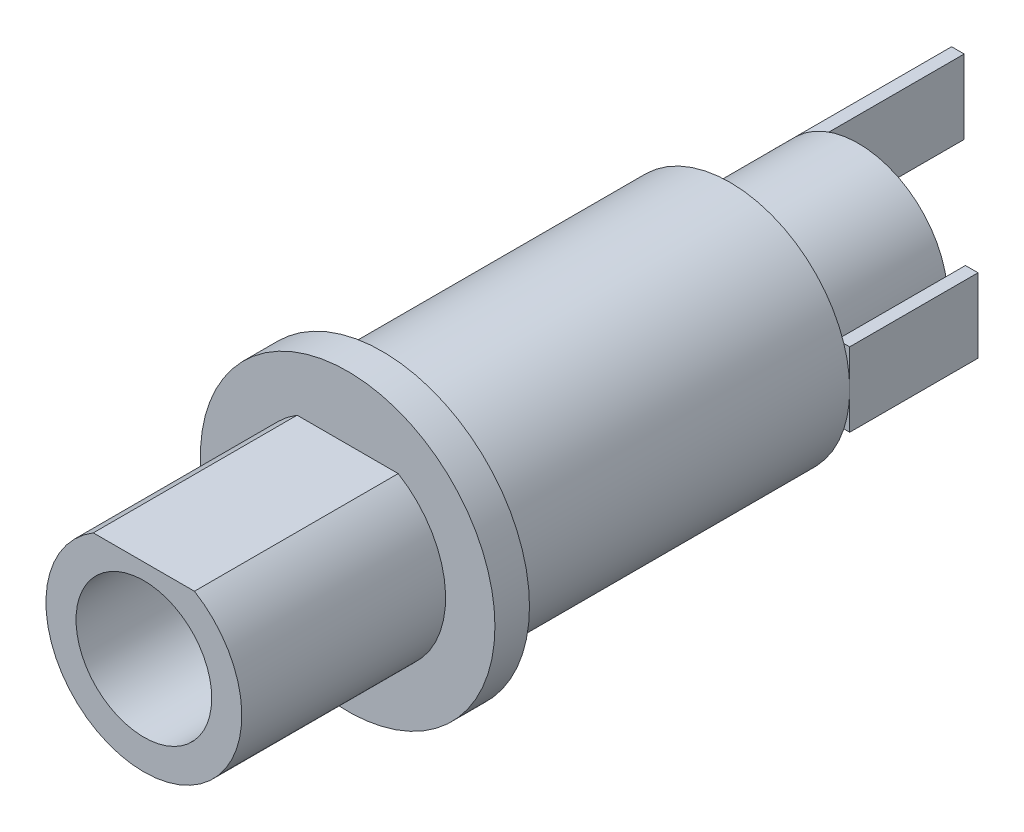
ISO-10303-21;
HEADER;
FILE_DESCRIPTION(('STEP AP214'),'2;1');
FILE_NAME('part.step','',(''),(''),'','','');
FILE_SCHEMA(('AUTOMOTIVE_DESIGN { 1 0 10303 214 1 1 1 1 }'));
ENDSEC;
DATA;
#1=APPLICATION_CONTEXT('core data for automotive mechanical design processes');
#2=APPLICATION_PROTOCOL_DEFINITION('international standard','automotive_design',2000,#1);
#3=PRODUCT_CONTEXT('',#1,'mechanical');
#4=PRODUCT('Part','Part','',(#3));
#5=PRODUCT_RELATED_PRODUCT_CATEGORY('part','',(#4));
#6=PRODUCT_DEFINITION_FORMATION('','',#4);
#7=PRODUCT_DEFINITION_CONTEXT('part definition',#1,'design');
#8=PRODUCT_DEFINITION('design','',#6,#7);
#9=PRODUCT_DEFINITION_SHAPE('','',#8);
#10=(LENGTH_UNIT() NAMED_UNIT(*) SI_UNIT(.MILLI.,.METRE.));
#11=(NAMED_UNIT(*) PLANE_ANGLE_UNIT() SI_UNIT($,.RADIAN.));
#12=(NAMED_UNIT(*) SI_UNIT($,.STERADIAN.) SOLID_ANGLE_UNIT());
#13=UNCERTAINTY_MEASURE_WITH_UNIT(LENGTH_MEASURE(1.E-05),#10,'distance_accuracy_value','');
#14=(GEOMETRIC_REPRESENTATION_CONTEXT(3) GLOBAL_UNCERTAINTY_ASSIGNED_CONTEXT((#13)) GLOBAL_UNIT_ASSIGNED_CONTEXT((#10,
#11,#12)) REPRESENTATION_CONTEXT('',''));
#15=CARTESIAN_POINT('',(0.,0.,0.));
#16=DIRECTION('',(0.,0.,1.));
#17=DIRECTION('',(1.,0.,0.));
#18=AXIS2_PLACEMENT_3D('',#15,#16,#17);
#19=CARTESIAN_POINT('',(0.,0.,-14.1));
#20=DIRECTION('',(0.,0.,-1.));
#21=DIRECTION('',(-1.,0.,0.));
#22=AXIS2_PLACEMENT_3D('',#19,#20,#21);
#23=PLANE('',#22);
#24=CARTESIAN_POINT('',(0.,0.,-14.1));
#25=DIRECTION('',(0.,0.,-1.));
#26=DIRECTION('',(-1.,0.,0.));
#27=AXIS2_PLACEMENT_3D('',#24,#25,#26);
#28=CIRCLE('',#27,3.62);
#29=CARTESIAN_POINT('',(-3.62,0.,-14.1));
#30=VERTEX_POINT('',#29);
#31=EDGE_CURVE('E194',#30,#30,#28,.T.);
#32=ORIENTED_EDGE('',*,*,#31,.F.);
#33=EDGE_LOOP('',(#32));
#34=FACE_BOUND('',#33,.T.);
#35=DIRECTION('',(0.,1.,0.));
#36=VECTOR('',#35,1.);
#37=CARTESIAN_POINT('',(4.34,1.5,-14.1));
#38=LINE('',#37,#36);
#39=CARTESIAN_POINT('',(4.34,-1.5,-14.1));
#40=VERTEX_POINT('',#39);
#41=CARTESIAN_POINT('',(4.34,1.5,-14.1));
#42=VERTEX_POINT('',#41);
#43=EDGE_CURVE('E172',#40,#42,#38,.T.);
#44=ORIENTED_EDGE('',*,*,#43,.F.);
#45=DIRECTION('',(1.,0.,0.));
#46=VECTOR('',#45,1.);
#47=CARTESIAN_POINT('',(0.,-1.5,-14.1));
#48=LINE('',#47,#46);
#49=CARTESIAN_POINT('',(4.61221205063254,-1.5,-14.1));
#50=VERTEX_POINT('',#49);
#51=EDGE_CURVE('E38',#40,#50,#48,.T.);
#52=ORIENTED_EDGE('',*,*,#51,.T.);
#53=CARTESIAN_POINT('',(0.,0.,-14.1));
#54=DIRECTION('',(0.,0.,-1.));
#55=DIRECTION('',(-1.,0.,0.));
#56=AXIS2_PLACEMENT_3D('',#53,#54,#55);
#57=CIRCLE('',#56,4.85);
#58=CARTESIAN_POINT('',(4.61221205063254,1.5,-14.1));
#59=VERTEX_POINT('',#58);
#60=EDGE_CURVE('E220',#50,#59,#57,.T.);
#61=ORIENTED_EDGE('',*,*,#60,.T.);
#62=DIRECTION('',(1.,0.,0.));
#63=VECTOR('',#62,1.);
#64=CARTESIAN_POINT('',(4.85,1.5,-14.1));
#65=LINE('',#64,#63);
#66=EDGE_CURVE('E161',#42,#59,#65,.T.);
#67=ORIENTED_EDGE('',*,*,#66,.F.);
#68=EDGE_LOOP('',(#44,#52,#61,#67));
#69=FACE_BOUND('',#68,.T.);
#70=ADVANCED_FACE('F34',(#34,#69),#23,.T.);
#71=CARTESIAN_POINT('',(0.,0.,9.66));
#72=DIRECTION('',(0.,0.,1.));
#73=DIRECTION('',(1.,0.,0.));
#74=AXIS2_PLACEMENT_3D('',#71,#72,#73);
#75=PLANE('',#74);
#76=CARTESIAN_POINT('',(0.,0.,9.66));
#77=DIRECTION('',(0.,0.,1.));
#78=DIRECTION('',(1.,0.,0.));
#79=AXIS2_PLACEMENT_3D('',#76,#77,#78);
#80=CIRCLE('',#79,2.75);
#81=CARTESIAN_POINT('',(2.75,0.,9.66));
#82=VERTEX_POINT('',#81);
#83=EDGE_CURVE('E211',#82,#82,#80,.T.);
#84=ORIENTED_EDGE('',*,*,#83,.F.);
#85=EDGE_LOOP('',(#84));
#86=FACE_BOUND('',#85,.T.);
#87=CARTESIAN_POINT('',(0.,0.,9.66));
#88=DIRECTION('',(0.,0.,1.));
#89=DIRECTION('',(1.,0.,0.));
#90=AXIS2_PLACEMENT_3D('',#87,#88,#89);
#91=CIRCLE('',#90,3.97);
#92=CARTESIAN_POINT('',(-2.04960971894651,3.4,9.66));
#93=VERTEX_POINT('',#92);
#94=CARTESIAN_POINT('',(2.04960971894651,3.4,9.66));
#95=VERTEX_POINT('',#94);
#96=EDGE_CURVE('E217',#93,#95,#91,.T.);
#97=ORIENTED_EDGE('',*,*,#96,.T.);
#98=DIRECTION('',(-1.,0.,0.));
#99=VECTOR('',#98,1.);
#100=CARTESIAN_POINT('',(5.971,3.4,9.66));
#101=LINE('',#100,#99);
#102=EDGE_CURVE('E204',#95,#93,#101,.T.);
#103=ORIENTED_EDGE('',*,*,#102,.T.);
#104=EDGE_LOOP('',(#97,#103));
#105=FACE_BOUND('',#104,.T.);
#106=ADVANCED_FACE('F261',(#86,#105),#75,.T.);
#107=CARTESIAN_POINT('',(0.,0.,9.66));
#108=DIRECTION('',(0.,0.,-1.));
#109=DIRECTION('',(-1.,0.,0.));
#110=AXIS2_PLACEMENT_3D('',#107,#108,#109);
#111=CYLINDRICAL_SURFACE('',#110,3.97);
#112=DIRECTION('',(0.,0.,-1.));
#113=VECTOR('',#112,1.);
#114=CARTESIAN_POINT('',(2.04960971894651,3.4,9.66));
#115=LINE('',#114,#113);
#116=CARTESIAN_POINT('',(2.04960971894651,3.4,1.4));
#117=VERTEX_POINT('',#116);
#118=EDGE_CURVE('E199',#117,#95,#115,.F.);
#119=ORIENTED_EDGE('',*,*,#118,.T.);
#120=ORIENTED_EDGE('',*,*,#96,.F.);
#121=DIRECTION('',(0.,0.,-1.));
#122=VECTOR('',#121,1.);
#123=CARTESIAN_POINT('',(-2.04960971894651,3.4,9.66));
#124=LINE('',#123,#122);
#125=CARTESIAN_POINT('',(-2.04960971894651,3.4,1.4));
#126=VERTEX_POINT('',#125);
#127=EDGE_CURVE('E192',#126,#93,#124,.F.);
#128=ORIENTED_EDGE('',*,*,#127,.F.);
#129=CARTESIAN_POINT('',(0.,0.,1.4));
#130=DIRECTION('',(0.,0.,1.));
#131=DIRECTION('',(1.,0.,0.));
#132=AXIS2_PLACEMENT_3D('',#129,#130,#131);
#133=CIRCLE('',#132,3.97);
#134=EDGE_CURVE('E216',#126,#117,#133,.T.);
#135=ORIENTED_EDGE('',*,*,#134,.T.);
#136=EDGE_LOOP('',(#119,#120,#128,#135));
#137=FACE_BOUND('',#136,.T.);
#138=ADVANCED_FACE('F267',(#137),#111,.T.);
#139=CARTESIAN_POINT('',(0.,0.,1.4));
#140=DIRECTION('',(0.,0.,-1.));
#141=DIRECTION('',(-1.,0.,0.));
#142=AXIS2_PLACEMENT_3D('',#139,#140,#141);
#143=CYLINDRICAL_SURFACE('',#142,5.97);
#144=CARTESIAN_POINT('',(0.,0.,1.4));
#145=DIRECTION('',(0.,0.,1.));
#146=DIRECTION('',(1.,0.,0.));
#147=AXIS2_PLACEMENT_3D('',#144,#145,#146);
#148=CIRCLE('',#147,5.97);
#149=CARTESIAN_POINT('',(5.97,0.,1.4));
#150=VERTEX_POINT('',#149);
#151=EDGE_CURVE('E230',#150,#150,#148,.T.);
#152=ORIENTED_EDGE('',*,*,#151,.F.);
#153=EDGE_LOOP('',(#152));
#154=FACE_BOUND('',#153,.T.);
#155=CARTESIAN_POINT('',(0.,0.,0.));
#156=DIRECTION('',(0.,0.,1.));
#157=DIRECTION('',(1.,0.,0.));
#158=AXIS2_PLACEMENT_3D('',#155,#156,#157);
#159=CIRCLE('',#158,5.97);
#160=CARTESIAN_POINT('',(5.97,0.,0.));
#161=VERTEX_POINT('',#160);
#162=EDGE_CURVE('E225',#161,#161,#159,.T.);
#163=ORIENTED_EDGE('',*,*,#162,.T.);
#164=EDGE_LOOP('',(#163));
#165=FACE_BOUND('',#164,.T.);
#166=ADVANCED_FACE('F36',(#154,#165),#143,.T.);
#167=CARTESIAN_POINT('',(0.,0.,1.4));
#168=DIRECTION('',(0.,0.,1.));
#169=DIRECTION('',(1.,0.,0.));
#170=AXIS2_PLACEMENT_3D('',#167,#168,#169);
#171=PLANE('',#170);
#172=ORIENTED_EDGE('',*,*,#134,.F.);
#173=DIRECTION('',(-1.,0.,0.));
#174=VECTOR('',#173,1.);
#175=CARTESIAN_POINT('',(5.971,3.4,1.4));
#176=LINE('',#175,#174);
#177=EDGE_CURVE('E202',#117,#126,#176,.T.);
#178=ORIENTED_EDGE('',*,*,#177,.F.);
#179=EDGE_LOOP('',(#172,#178));
#180=FACE_BOUND('',#179,.T.);
#181=ORIENTED_EDGE('',*,*,#151,.T.);
#182=EDGE_LOOP('',(#181));
#183=FACE_BOUND('',#182,.T.);
#184=ADVANCED_FACE('F244',(#180,#183),#171,.T.);
#185=CARTESIAN_POINT('',(0.,0.,0.));
#186=DIRECTION('',(0.,0.,1.));
#187=DIRECTION('',(1.,0.,0.));
#188=AXIS2_PLACEMENT_3D('',#185,#186,#187);
#189=PLANE('',#188);
#190=CARTESIAN_POINT('',(0.,0.,0.));
#191=DIRECTION('',(0.,0.,-1.));
#192=DIRECTION('',(-1.,0.,0.));
#193=AXIS2_PLACEMENT_3D('',#190,#191,#192);
#194=CIRCLE('',#193,4.85);
#195=CARTESIAN_POINT('',(-4.85,0.,0.));
#196=VERTEX_POINT('',#195);
#197=EDGE_CURVE('E227',#196,#196,#194,.T.);
#198=ORIENTED_EDGE('',*,*,#197,.F.);
#199=EDGE_LOOP('',(#198));
#200=FACE_BOUND('',#199,.T.);
#201=ORIENTED_EDGE('',*,*,#162,.F.);
#202=EDGE_LOOP('',(#201));
#203=FACE_BOUND('',#202,.T.);
#204=ADVANCED_FACE('F258',(#200,#203),#189,.F.);
#205=CARTESIAN_POINT('',(0.,0.,-14.1));
#206=DIRECTION('',(0.,0.,1.));
#207=DIRECTION('',(1.,0.,0.));
#208=AXIS2_PLACEMENT_3D('',#205,#206,#207);
#209=CYLINDRICAL_SURFACE('',#208,4.85);
#210=CARTESIAN_POINT('',(4.85,0.,-14.1));
#211=VERTEX_POINT('',#210);
#212=EDGE_CURVE('E223',#59,#211,#57,.T.);
#213=ORIENTED_EDGE('',*,*,#212,.F.);
#214=ORIENTED_EDGE('',*,*,#60,.F.);
#215=EDGE_CURVE('E226',#211,#50,#57,.T.);
#216=ORIENTED_EDGE('',*,*,#215,.F.);
#217=EDGE_LOOP('',(#213,#214,#216));
#218=FACE_BOUND('',#217,.T.);
#219=ORIENTED_EDGE('',*,*,#197,.T.);
#220=EDGE_LOOP('',(#219));
#221=FACE_BOUND('',#220,.T.);
#222=ADVANCED_FACE('F252',(#218,#221),#209,.T.);
#223=CARTESIAN_POINT('',(0.,0.,9.66));
#224=DIRECTION('',(0.,0.,-1.));
#225=DIRECTION('',(-1.,0.,0.));
#226=AXIS2_PLACEMENT_3D('',#223,#224,#225);
#227=CYLINDRICAL_SURFACE('',#226,2.75);
#228=ORIENTED_EDGE('',*,*,#83,.T.);
#229=EDGE_LOOP('',(#228));
#230=FACE_BOUND('',#229,.T.);
#231=CARTESIAN_POINT('',(0.,0.,1.4));
#232=DIRECTION('',(0.,0.,1.));
#233=DIRECTION('',(1.,0.,0.));
#234=AXIS2_PLACEMENT_3D('',#231,#232,#233);
#235=CIRCLE('',#234,2.75);
#236=CARTESIAN_POINT('',(2.75,0.,1.4));
#237=VERTEX_POINT('',#236);
#238=EDGE_CURVE('E197',#237,#237,#235,.F.);
#239=ORIENTED_EDGE('',*,*,#238,.T.);
#240=EDGE_LOOP('',(#239));
#241=FACE_BOUND('',#240,.T.);
#242=ADVANCED_FACE('F237',(#230,#241),#227,.F.);
#243=CARTESIAN_POINT('',(0.,0.,1.4));
#244=DIRECTION('',(0.,0.,1.));
#245=DIRECTION('',(1.,0.,0.));
#246=AXIS2_PLACEMENT_3D('',#243,#244,#245);
#247=CIRCLE('',#246,1.);
#248=CARTESIAN_POINT('',(1.,0.,1.4));
#249=VERTEX_POINT('',#248);
#250=EDGE_CURVE('E207',#249,#249,#247,.T.);
#251=ORIENTED_EDGE('',*,*,#250,.F.);
#252=EDGE_LOOP('',(#251));
#253=FACE_BOUND('',#252,.T.);
#254=ORIENTED_EDGE('',*,*,#238,.F.);
#255=EDGE_LOOP('',(#254));
#256=FACE_BOUND('',#255,.T.);
#257=ADVANCED_FACE('F239',(#253,#256),#171,.T.);
#258=CARTESIAN_POINT('',(0.,0.,6.4));
#259=DIRECTION('',(0.,0.,-1.));
#260=DIRECTION('',(-1.,0.,0.));
#261=AXIS2_PLACEMENT_3D('',#258,#259,#260);
#262=CYLINDRICAL_SURFACE('',#261,1.);
#263=CARTESIAN_POINT('',(0.,0.,6.4));
#264=DIRECTION('',(0.,0.,1.));
#265=DIRECTION('',(1.,0.,0.));
#266=AXIS2_PLACEMENT_3D('',#263,#264,#265);
#267=CIRCLE('',#266,1.);
#268=CARTESIAN_POINT('',(1.,0.,6.4));
#269=VERTEX_POINT('',#268);
#270=EDGE_CURVE('E208',#269,#269,#267,.T.);
#271=ORIENTED_EDGE('',*,*,#270,.F.);
#272=EDGE_LOOP('',(#271));
#273=FACE_BOUND('',#272,.T.);
#274=ORIENTED_EDGE('',*,*,#250,.T.);
#275=EDGE_LOOP('',(#274));
#276=FACE_BOUND('',#275,.T.);
#277=ADVANCED_FACE('F241',(#273,#276),#262,.T.);
#278=CARTESIAN_POINT('',(0.,0.,6.4));
#279=DIRECTION('',(0.,0.,1.));
#280=DIRECTION('',(1.,0.,0.));
#281=AXIS2_PLACEMENT_3D('',#278,#279,#280);
#282=PLANE('',#281);
#283=ORIENTED_EDGE('',*,*,#270,.T.);
#284=EDGE_LOOP('',(#283));
#285=FACE_BOUND('',#284,.T.);
#286=ADVANCED_FACE('F249',(#285),#282,.T.);
#287=CARTESIAN_POINT('',(5.971,3.4,1.4));
#288=DIRECTION('',(0.,1.,0.));
#289=DIRECTION('',(0.,0.,1.));
#290=AXIS2_PLACEMENT_3D('',#287,#288,#289);
#291=PLANE('',#290);
#292=ORIENTED_EDGE('',*,*,#177,.T.);
#293=ORIENTED_EDGE('',*,*,#127,.T.);
#294=ORIENTED_EDGE('',*,*,#102,.F.);
#295=ORIENTED_EDGE('',*,*,#118,.F.);
#296=EDGE_LOOP('',(#292,#293,#294,#295));
#297=FACE_BOUND('',#296,.T.);
#298=ADVANCED_FACE('F303',(#297),#291,.T.);
#299=CARTESIAN_POINT('',(0.,0.,-19.3));
#300=DIRECTION('',(0.,0.,1.));
#301=DIRECTION('',(1.,0.,0.));
#302=AXIS2_PLACEMENT_3D('',#299,#300,#301);
#303=CYLINDRICAL_SURFACE('',#302,3.62);
#304=CARTESIAN_POINT('',(0.,0.,-19.3));
#305=DIRECTION('',(0.,0.,-1.));
#306=DIRECTION('',(-1.,0.,0.));
#307=AXIS2_PLACEMENT_3D('',#304,#305,#306);
#308=CIRCLE('',#307,3.62);
#309=CARTESIAN_POINT('',(-3.62,0.,-19.3));
#310=VERTEX_POINT('',#309);
#311=CARTESIAN_POINT('',(-3.29460164511584,1.5,-19.3));
#312=VERTEX_POINT('',#311);
#313=EDGE_CURVE('E189',#310,#312,#308,.T.);
#314=ORIENTED_EDGE('',*,*,#313,.F.);
#315=CARTESIAN_POINT('',(-3.29460164511584,-1.5,-19.3));
#316=VERTEX_POINT('',#315);
#317=EDGE_CURVE('E188',#316,#310,#308,.T.);
#318=ORIENTED_EDGE('',*,*,#317,.F.);
#319=EDGE_CURVE('E193',#312,#316,#308,.T.);
#320=ORIENTED_EDGE('',*,*,#319,.F.);
#321=EDGE_LOOP('',(#314,#318,#320));
#322=FACE_BOUND('',#321,.T.);
#323=ORIENTED_EDGE('',*,*,#31,.T.);
#324=EDGE_LOOP('',(#323));
#325=FACE_BOUND('',#324,.T.);
#326=ADVANCED_FACE('F305',(#322,#325),#303,.T.);
#327=CARTESIAN_POINT('',(0.,0.,-19.3));
#328=DIRECTION('',(0.,0.,-1.));
#329=DIRECTION('',(-1.,0.,0.));
#330=AXIS2_PLACEMENT_3D('',#327,#328,#329);
#331=PLANE('',#330);
#332=DIRECTION('',(1.,0.,0.));
#333=VECTOR('',#332,1.);
#334=CARTESIAN_POINT('',(-3.11,1.5,-19.3));
#335=LINE('',#334,#333);
#336=CARTESIAN_POINT('',(-3.11,1.5,-19.3));
#337=VERTEX_POINT('',#336);
#338=EDGE_CURVE('E11',#312,#337,#335,.T.);
#339=ORIENTED_EDGE('',*,*,#338,.F.);
#340=ORIENTED_EDGE('',*,*,#319,.T.);
#341=DIRECTION('',(-1.,0.,0.));
#342=VECTOR('',#341,1.);
#343=CARTESIAN_POINT('',(-3.11,-1.5,-19.3));
#344=LINE('',#343,#342);
#345=CARTESIAN_POINT('',(-3.11,-1.5,-19.3));
#346=VERTEX_POINT('',#345);
#347=EDGE_CURVE('E55',#346,#316,#344,.T.);
#348=ORIENTED_EDGE('',*,*,#347,.F.);
#349=DIRECTION('',(0.,-1.,0.));
#350=VECTOR('',#349,1.);
#351=CARTESIAN_POINT('',(-3.11,1.5,-19.3));
#352=LINE('',#351,#350);
#353=EDGE_CURVE('E51',#337,#346,#352,.T.);
#354=ORIENTED_EDGE('',*,*,#353,.F.);
#355=EDGE_LOOP('',(#339,#340,#348,#354));
#356=FACE_BOUND('',#355,.T.);
#357=ADVANCED_FACE('F311',(#356),#331,.T.);
#358=CARTESIAN_POINT('',(0.,0.,-14.1));
#359=DIRECTION('',(0.,0.,-1.));
#360=DIRECTION('',(-1.,0.,0.));
#361=AXIS2_PLACEMENT_3D('',#358,#359,#360);
#362=PLANE('',#361);
#363=CARTESIAN_POINT('',(4.85,1.5,-14.1));
#364=VERTEX_POINT('',#363);
#365=EDGE_CURVE('E175',#59,#364,#65,.T.);
#366=ORIENTED_EDGE('',*,*,#365,.F.);
#367=ORIENTED_EDGE('',*,*,#212,.T.);
#368=DIRECTION('',(0.,-1.,0.));
#369=VECTOR('',#368,1.);
#370=CARTESIAN_POINT('',(4.85,1.5,-14.1));
#371=LINE('',#370,#369);
#372=EDGE_CURVE('E151',#364,#211,#371,.T.);
#373=ORIENTED_EDGE('',*,*,#372,.F.);
#374=EDGE_LOOP('',(#366,#367,#373));
#375=FACE_BOUND('',#374,.T.);
#376=ADVANCED_FACE('F319',(#375),#362,.F.);
#377=CARTESIAN_POINT('',(4.85,1.5,-19.3));
#378=DIRECTION('',(-1.,0.,0.));
#379=DIRECTION('',(0.,0.,1.));
#380=AXIS2_PLACEMENT_3D('',#377,#378,#379);
#381=PLANE('',#380);
#382=ORIENTED_EDGE('',*,*,#372,.T.);
#383=CARTESIAN_POINT('',(4.85,-1.5,-14.1));
#384=VERTEX_POINT('',#383);
#385=EDGE_CURVE('E149',#211,#384,#371,.T.);
#386=ORIENTED_EDGE('',*,*,#385,.T.);
#387=DIRECTION('',(0.,0.,1.));
#388=VECTOR('',#387,1.);
#389=CARTESIAN_POINT('',(4.85,-1.5,-19.3));
#390=LINE('',#389,#388);
#391=CARTESIAN_POINT('',(4.85,-1.5,-19.3));
#392=VERTEX_POINT('',#391);
#393=EDGE_CURVE('E185',#392,#384,#390,.T.);
#394=ORIENTED_EDGE('',*,*,#393,.F.);
#395=DIRECTION('',(0.,-1.,0.));
#396=VECTOR('',#395,1.);
#397=CARTESIAN_POINT('',(4.85,1.5,-19.3));
#398=LINE('',#397,#396);
#399=CARTESIAN_POINT('',(4.85,1.5,-19.3));
#400=VERTEX_POINT('',#399);
#401=EDGE_CURVE('E157',#400,#392,#398,.T.);
#402=ORIENTED_EDGE('',*,*,#401,.F.);
#403=DIRECTION('',(0.,0.,1.));
#404=VECTOR('',#403,1.);
#405=CARTESIAN_POINT('',(4.85,1.5,-19.3));
#406=LINE('',#405,#404);
#407=EDGE_CURVE('E166',#400,#364,#406,.T.);
#408=ORIENTED_EDGE('',*,*,#407,.T.);
#409=EDGE_LOOP('',(#382,#386,#394,#402,#408));
#410=FACE_BOUND('',#409,.T.);
#411=ADVANCED_FACE('F320',(#410),#381,.F.);
#412=CARTESIAN_POINT('',(4.85,-1.5,-19.3));
#413=DIRECTION('',(0.,1.,0.));
#414=DIRECTION('',(0.,0.,1.));
#415=AXIS2_PLACEMENT_3D('',#412,#413,#414);
#416=PLANE('',#415);
#417=DIRECTION('',(-1.,0.,0.));
#418=VECTOR('',#417,1.);
#419=CARTESIAN_POINT('',(4.85,-1.5,-14.1));
#420=LINE('',#419,#418);
#421=EDGE_CURVE('E169',#384,#50,#420,.T.);
#422=ORIENTED_EDGE('',*,*,#421,.T.);
#423=ORIENTED_EDGE('',*,*,#51,.F.);
#424=DIRECTION('',(0.,0.,1.));
#425=VECTOR('',#424,1.);
#426=CARTESIAN_POINT('',(4.34,-1.5,-19.3));
#427=LINE('',#426,#425);
#428=CARTESIAN_POINT('',(4.34,-1.5,-19.3));
#429=VERTEX_POINT('',#428);
#430=EDGE_CURVE('E182',#429,#40,#427,.T.);
#431=ORIENTED_EDGE('',*,*,#430,.F.);
#432=DIRECTION('',(-1.,0.,0.));
#433=VECTOR('',#432,1.);
#434=CARTESIAN_POINT('',(4.85,-1.5,-19.3));
#435=LINE('',#434,#433);
#436=EDGE_CURVE('E160',#392,#429,#435,.T.);
#437=ORIENTED_EDGE('',*,*,#436,.F.);
#438=ORIENTED_EDGE('',*,*,#393,.T.);
#439=EDGE_LOOP('',(#422,#423,#431,#437,#438));
#440=FACE_BOUND('',#439,.T.);
#441=ADVANCED_FACE('F323',(#440),#416,.F.);
#442=CARTESIAN_POINT('',(4.34,1.5,-19.3));
#443=DIRECTION('',(1.,0.,0.));
#444=DIRECTION('',(0.,0.,-1.));
#445=AXIS2_PLACEMENT_3D('',#442,#443,#444);
#446=PLANE('',#445);
#447=ORIENTED_EDGE('',*,*,#43,.T.);
#448=DIRECTION('',(0.,0.,1.));
#449=VECTOR('',#448,1.);
#450=CARTESIAN_POINT('',(4.34,1.5,-19.3));
#451=LINE('',#450,#449);
#452=CARTESIAN_POINT('',(4.34,1.5,-19.3));
#453=VERTEX_POINT('',#452);
#454=EDGE_CURVE('E180',#453,#42,#451,.T.);
#455=ORIENTED_EDGE('',*,*,#454,.F.);
#456=DIRECTION('',(0.,1.,0.));
#457=VECTOR('',#456,1.);
#458=CARTESIAN_POINT('',(4.34,1.5,-19.3));
#459=LINE('',#458,#457);
#460=EDGE_CURVE('E163',#429,#453,#459,.T.);
#461=ORIENTED_EDGE('',*,*,#460,.F.);
#462=ORIENTED_EDGE('',*,*,#430,.T.);
#463=EDGE_LOOP('',(#447,#455,#461,#462));
#464=FACE_BOUND('',#463,.T.);
#465=ADVANCED_FACE('F327',(#464),#446,.F.);
#466=CARTESIAN_POINT('',(4.85,1.5,-19.3));
#467=DIRECTION('',(0.,-1.,0.));
#468=DIRECTION('',(0.,0.,-1.));
#469=AXIS2_PLACEMENT_3D('',#466,#467,#468);
#470=PLANE('',#469);
#471=ORIENTED_EDGE('',*,*,#66,.T.);
#472=ORIENTED_EDGE('',*,*,#365,.T.);
#473=ORIENTED_EDGE('',*,*,#407,.F.);
#474=DIRECTION('',(1.,0.,0.));
#475=VECTOR('',#474,1.);
#476=CARTESIAN_POINT('',(4.85,1.5,-19.3));
#477=LINE('',#476,#475);
#478=EDGE_CURVE('E165',#453,#400,#477,.T.);
#479=ORIENTED_EDGE('',*,*,#478,.F.);
#480=ORIENTED_EDGE('',*,*,#454,.T.);
#481=EDGE_LOOP('',(#471,#472,#473,#479,#480));
#482=FACE_BOUND('',#481,.T.);
#483=ADVANCED_FACE('F331',(#482),#470,.F.);
#484=CARTESIAN_POINT('',(0.,0.,-19.3));
#485=DIRECTION('',(0.,0.,-1.));
#486=DIRECTION('',(-1.,0.,0.));
#487=AXIS2_PLACEMENT_3D('',#484,#485,#486);
#488=PLANE('',#487);
#489=ORIENTED_EDGE('',*,*,#401,.T.);
#490=ORIENTED_EDGE('',*,*,#436,.T.);
#491=ORIENTED_EDGE('',*,*,#460,.T.);
#492=ORIENTED_EDGE('',*,*,#478,.T.);
#493=EDGE_LOOP('',(#489,#490,#491,#492));
#494=FACE_BOUND('',#493,.T.);
#495=ADVANCED_FACE('F335',(#494),#488,.T.);
#496=ORIENTED_EDGE('',*,*,#385,.F.);
#497=ORIENTED_EDGE('',*,*,#215,.T.);
#498=ORIENTED_EDGE('',*,*,#421,.F.);
#499=EDGE_LOOP('',(#496,#497,#498));
#500=FACE_BOUND('',#499,.T.);
#501=ADVANCED_FACE('F337',(#500),#362,.F.);
#502=CARTESIAN_POINT('',(0.,0.,-19.3));
#503=DIRECTION('',(0.,0.,-1.));
#504=DIRECTION('',(-1.,0.,0.));
#505=AXIS2_PLACEMENT_3D('',#502,#503,#504);
#506=PLANE('',#505);
#507=DIRECTION('',(0.,1.,0.));
#508=VECTOR('',#507,1.);
#509=CARTESIAN_POINT('',(-3.62,1.5,-19.3));
#510=LINE('',#509,#508);
#511=CARTESIAN_POINT('',(-3.62,1.5,-19.3));
#512=VERTEX_POINT('',#511);
#513=EDGE_CURVE('E548',#310,#512,#510,.T.);
#514=ORIENTED_EDGE('',*,*,#513,.F.);
#515=ORIENTED_EDGE('',*,*,#313,.T.);
#516=EDGE_CURVE('E44',#512,#312,#335,.T.);
#517=ORIENTED_EDGE('',*,*,#516,.F.);
#518=EDGE_LOOP('',(#514,#515,#517));
#519=FACE_BOUND('',#518,.T.);
#520=ADVANCED_FACE('F340',(#519),#506,.F.);
#521=CARTESIAN_POINT('',(-3.62,-1.5,-19.3));
#522=VERTEX_POINT('',#521);
#523=EDGE_CURVE('E542',#316,#522,#344,.T.);
#524=ORIENTED_EDGE('',*,*,#523,.F.);
#525=ORIENTED_EDGE('',*,*,#317,.T.);
#526=EDGE_CURVE('E546',#522,#310,#510,.T.);
#527=ORIENTED_EDGE('',*,*,#526,.F.);
#528=EDGE_LOOP('',(#524,#525,#527));
#529=FACE_BOUND('',#528,.T.);
#530=ADVANCED_FACE('F347',(#529),#506,.F.);
#531=CARTESIAN_POINT('',(-3.11,1.5,-26.7));
#532=DIRECTION('',(-1.,0.,0.));
#533=DIRECTION('',(0.,0.,1.));
#534=AXIS2_PLACEMENT_3D('',#531,#532,#533);
#535=PLANE('',#534);
#536=ORIENTED_EDGE('',*,*,#353,.T.);
#537=DIRECTION('',(0.,0.,1.));
#538=VECTOR('',#537,1.);
#539=CARTESIAN_POINT('',(-3.11,-1.5,-26.7));
#540=LINE('',#539,#538);
#541=CARTESIAN_POINT('',(-3.11,-1.5,-26.7));
#542=VERTEX_POINT('',#541);
#543=EDGE_CURVE('E132',#542,#346,#540,.T.);
#544=ORIENTED_EDGE('',*,*,#543,.F.);
#545=DIRECTION('',(0.,-1.,0.));
#546=VECTOR('',#545,1.);
#547=CARTESIAN_POINT('',(-3.11,1.5,-26.7));
#548=LINE('',#547,#546);
#549=CARTESIAN_POINT('',(-3.11,1.5,-26.7));
#550=VERTEX_POINT('',#549);
#551=EDGE_CURVE('E138',#550,#542,#548,.T.);
#552=ORIENTED_EDGE('',*,*,#551,.F.);
#553=DIRECTION('',(0.,0.,1.));
#554=VECTOR('',#553,1.);
#555=CARTESIAN_POINT('',(-3.11,1.5,-26.7));
#556=LINE('',#555,#554);
#557=EDGE_CURVE('E554',#550,#337,#556,.T.);
#558=ORIENTED_EDGE('',*,*,#557,.T.);
#559=EDGE_LOOP('',(#536,#544,#552,#558));
#560=FACE_BOUND('',#559,.T.);
#561=ADVANCED_FACE('F148',(#560),#535,.F.);
#562=CARTESIAN_POINT('',(-3.11,-1.5,-26.7));
#563=DIRECTION('',(0.,1.,0.));
#564=DIRECTION('',(0.,0.,1.));
#565=AXIS2_PLACEMENT_3D('',#562,#563,#564);
#566=PLANE('',#565);
#567=ORIENTED_EDGE('',*,*,#347,.T.);
#568=ORIENTED_EDGE('',*,*,#523,.T.);
#569=DIRECTION('',(0.,0.,1.));
#570=VECTOR('',#569,1.);
#571=CARTESIAN_POINT('',(-3.62,-1.5,-26.7));
#572=LINE('',#571,#570);
#573=CARTESIAN_POINT('',(-3.62,-1.5,-26.7));
#574=VERTEX_POINT('',#573);
#575=EDGE_CURVE('E134',#574,#522,#572,.T.);
#576=ORIENTED_EDGE('',*,*,#575,.F.);
#577=DIRECTION('',(-1.,0.,0.));
#578=VECTOR('',#577,1.);
#579=CARTESIAN_POINT('',(-3.11,-1.5,-26.7));
#580=LINE('',#579,#578);
#581=EDGE_CURVE('E128',#542,#574,#580,.T.);
#582=ORIENTED_EDGE('',*,*,#581,.F.);
#583=ORIENTED_EDGE('',*,*,#543,.T.);
#584=EDGE_LOOP('',(#567,#568,#576,#582,#583));
#585=FACE_BOUND('',#584,.T.);
#586=ADVANCED_FACE('F130',(#585),#566,.F.);
#587=CARTESIAN_POINT('',(-3.62,1.5,-26.7));
#588=DIRECTION('',(1.,0.,0.));
#589=DIRECTION('',(0.,0.,-1.));
#590=AXIS2_PLACEMENT_3D('',#587,#588,#589);
#591=PLANE('',#590);
#592=ORIENTED_EDGE('',*,*,#526,.T.);
#593=ORIENTED_EDGE('',*,*,#513,.T.);
#594=DIRECTION('',(0.,0.,1.));
#595=VECTOR('',#594,1.);
#596=CARTESIAN_POINT('',(-3.62,1.5,-26.7));
#597=LINE('',#596,#595);
#598=CARTESIAN_POINT('',(-3.62,1.5,-26.7));
#599=VERTEX_POINT('',#598);
#600=EDGE_CURVE('E153',#599,#512,#597,.T.);
#601=ORIENTED_EDGE('',*,*,#600,.F.);
#602=DIRECTION('',(0.,1.,0.));
#603=VECTOR('',#602,1.);
#604=CARTESIAN_POINT('',(-3.62,1.5,-26.7));
#605=LINE('',#604,#603);
#606=EDGE_CURVE('E137',#574,#599,#605,.T.);
#607=ORIENTED_EDGE('',*,*,#606,.F.);
#608=ORIENTED_EDGE('',*,*,#575,.T.);
#609=EDGE_LOOP('',(#592,#593,#601,#607,#608));
#610=FACE_BOUND('',#609,.T.);
#611=ADVANCED_FACE('F350',(#610),#591,.F.);
#612=CARTESIAN_POINT('',(-3.11,1.5,-26.7));
#613=DIRECTION('',(0.,-1.,0.));
#614=DIRECTION('',(0.,0.,-1.));
#615=AXIS2_PLACEMENT_3D('',#612,#613,#614);
#616=PLANE('',#615);
#617=ORIENTED_EDGE('',*,*,#516,.T.);
#618=ORIENTED_EDGE('',*,*,#338,.T.);
#619=ORIENTED_EDGE('',*,*,#557,.F.);
#620=DIRECTION('',(1.,0.,0.));
#621=VECTOR('',#620,1.);
#622=CARTESIAN_POINT('',(-3.11,1.5,-26.7));
#623=LINE('',#622,#621);
#624=EDGE_CURVE('E143',#599,#550,#623,.T.);
#625=ORIENTED_EDGE('',*,*,#624,.F.);
#626=ORIENTED_EDGE('',*,*,#600,.T.);
#627=EDGE_LOOP('',(#617,#618,#619,#625,#626));
#628=FACE_BOUND('',#627,.T.);
#629=ADVANCED_FACE('F353',(#628),#616,.F.);
#630=CARTESIAN_POINT('',(0.,0.,-26.7));
#631=DIRECTION('',(0.,0.,-1.));
#632=DIRECTION('',(-1.,0.,0.));
#633=AXIS2_PLACEMENT_3D('',#630,#631,#632);
#634=PLANE('',#633);
#635=ORIENTED_EDGE('',*,*,#551,.T.);
#636=ORIENTED_EDGE('',*,*,#581,.T.);
#637=ORIENTED_EDGE('',*,*,#606,.T.);
#638=ORIENTED_EDGE('',*,*,#624,.T.);
#639=EDGE_LOOP('',(#635,#636,#637,#638));
#640=FACE_BOUND('',#639,.T.);
#641=ADVANCED_FACE('F141',(#640),#634,.T.);
#642=CLOSED_SHELL('',(#70,#106,#138,#166,#184,#204,#222,#242,#257,#277,#286,#298,#326,#357,#376,
#411,#441,#465,#483,#495,#501,#520,#530,#561,#586,#611,#629,#641));
#643=MANIFOLD_SOLID_BREP('B2',#642);
#644=ADVANCED_BREP_SHAPE_REPRESENTATION('',(#18,#643),#14);
#645=SHAPE_DEFINITION_REPRESENTATION(#9,#644);
ENDSEC;
END-ISO-10303-21;
